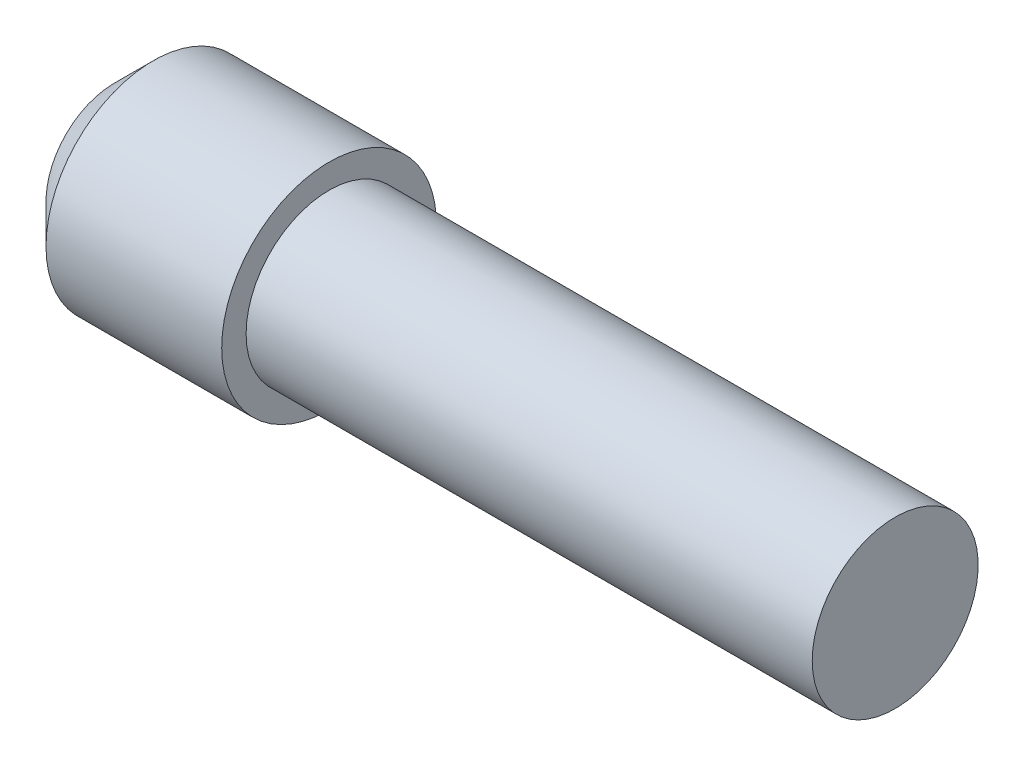
ISO-10303-21;
HEADER;
FILE_DESCRIPTION(('STEP AP214'),'2;1');
FILE_NAME('part.step','',(''),(''),'','','');
FILE_SCHEMA(('AUTOMOTIVE_DESIGN { 1 0 10303 214 1 1 1 1 }'));
ENDSEC;
DATA;
#1=APPLICATION_CONTEXT('core data for automotive mechanical design processes');
#2=APPLICATION_PROTOCOL_DEFINITION('international standard','automotive_design',2000,#1);
#3=PRODUCT_CONTEXT('',#1,'mechanical');
#4=PRODUCT('Part','Part','',(#3));
#5=PRODUCT_RELATED_PRODUCT_CATEGORY('part','',(#4));
#6=PRODUCT_DEFINITION_FORMATION('','',#4);
#7=PRODUCT_DEFINITION_CONTEXT('part definition',#1,'design');
#8=PRODUCT_DEFINITION('design','',#6,#7);
#9=PRODUCT_DEFINITION_SHAPE('','',#8);
#10=(LENGTH_UNIT() NAMED_UNIT(*) SI_UNIT(.MILLI.,.METRE.));
#11=(NAMED_UNIT(*) PLANE_ANGLE_UNIT() SI_UNIT($,.RADIAN.));
#12=(NAMED_UNIT(*) SI_UNIT($,.STERADIAN.) SOLID_ANGLE_UNIT());
#13=UNCERTAINTY_MEASURE_WITH_UNIT(LENGTH_MEASURE(1.E-05),#10,'distance_accuracy_value','');
#14=(GEOMETRIC_REPRESENTATION_CONTEXT(3) GLOBAL_UNCERTAINTY_ASSIGNED_CONTEXT((#13)) GLOBAL_UNIT_ASSIGNED_CONTEXT((#10,
#11,#12)) REPRESENTATION_CONTEXT('',''));
#15=CARTESIAN_POINT('',(0.,0.,0.));
#16=DIRECTION('',(0.,0.,1.));
#17=DIRECTION('',(1.,0.,0.));
#18=AXIS2_PLACEMENT_3D('',#15,#16,#17);
#19=CARTESIAN_POINT('',(0.,2.75,0.));
#20=DIRECTION('',(-1.,0.,0.));
#21=DIRECTION('',(0.,0.,1.));
#22=AXIS2_PLACEMENT_3D('',#19,#20,#21);
#23=PLANE('',#22);
#24=CARTESIAN_POINT('',(0.,0.,0.));
#25=DIRECTION('',(-1.,0.,0.));
#26=DIRECTION('',(0.,0.,1.));
#27=AXIS2_PLACEMENT_3D('',#24,#25,#26);
#28=CIRCLE('',#27,2.75);
#29=CARTESIAN_POINT('',(0.,0.,2.75));
#30=VERTEX_POINT('',#29);
#31=EDGE_CURVE('E50',#30,#30,#28,.T.);
#32=ORIENTED_EDGE('',*,*,#31,.F.);
#33=EDGE_LOOP('',(#32));
#34=FACE_BOUND('',#33,.T.);
#35=CARTESIAN_POINT('',(0.,0.,0.));
#36=DIRECTION('',(-1.,0.,0.));
#37=DIRECTION('',(0.,0.,1.));
#38=AXIS2_PLACEMENT_3D('',#35,#36,#37);
#39=CIRCLE('',#38,2.125);
#40=CARTESIAN_POINT('',(0.,0.,2.125));
#41=VERTEX_POINT('',#40);
#42=EDGE_CURVE('E59',#41,#41,#39,.T.);
#43=ORIENTED_EDGE('',*,*,#42,.T.);
#44=EDGE_LOOP('',(#43));
#45=FACE_BOUND('',#44,.T.);
#46=ADVANCED_FACE('F38',(#34,#45),#23,.F.);
#47=CARTESIAN_POINT('',(-9.45893719806763,0.,0.));
#48=DIRECTION('',(-1.,0.,0.));
#49=DIRECTION('',(0.,0.,1.));
#50=AXIS2_PLACEMENT_3D('',#47,#48,#49);
#51=CYLINDRICAL_SURFACE('',#50,2.75);
#52=CARTESIAN_POINT('',(-4.5,0.,0.));
#53=DIRECTION('',(1.,0.,0.));
#54=DIRECTION('',(0.,0.,-1.));
#55=AXIS2_PLACEMENT_3D('',#52,#53,#54);
#56=CIRCLE('',#55,2.75);
#57=CARTESIAN_POINT('',(-4.5,0.,-2.75));
#58=VERTEX_POINT('',#57);
#59=EDGE_CURVE('E10',#58,#58,#56,.T.);
#60=ORIENTED_EDGE('',*,*,#59,.T.);
#61=EDGE_LOOP('',(#60));
#62=FACE_BOUND('',#61,.T.);
#63=ORIENTED_EDGE('',*,*,#31,.T.);
#64=EDGE_LOOP('',(#63));
#65=FACE_BOUND('',#64,.T.);
#66=ADVANCED_FACE('F77',(#62,#65),#51,.T.);
#67=CARTESIAN_POINT('',(-5.5,2.75,0.));
#68=DIRECTION('',(1.,0.,0.));
#69=DIRECTION('',(0.,0.,-1.));
#70=AXIS2_PLACEMENT_3D('',#67,#68,#69);
#71=PLANE('',#70);
#72=CARTESIAN_POINT('',(-5.5,0.,0.));
#73=DIRECTION('',(1.,0.,0.));
#74=DIRECTION('',(0.,0.,-1.));
#75=AXIS2_PLACEMENT_3D('',#72,#73,#74);
#76=CIRCLE('',#75,1.75000000000001);
#77=CARTESIAN_POINT('',(-5.5,0.,-1.75000000000001));
#78=VERTEX_POINT('',#77);
#79=EDGE_CURVE('E46',#78,#78,#76,.F.);
#80=ORIENTED_EDGE('',*,*,#79,.T.);
#81=EDGE_LOOP('',(#80));
#82=FACE_BOUND('',#81,.T.);
#83=ADVANCED_FACE('F72',(#82),#71,.F.);
#84=CARTESIAN_POINT('',(14.5,2.125,0.));
#85=DIRECTION('',(-1.,0.,0.));
#86=DIRECTION('',(0.,0.,1.));
#87=AXIS2_PLACEMENT_3D('',#84,#85,#86);
#88=PLANE('',#87);
#89=CARTESIAN_POINT('',(14.5,0.,0.));
#90=DIRECTION('',(-1.,0.,0.));
#91=DIRECTION('',(0.,0.,1.));
#92=AXIS2_PLACEMENT_3D('',#89,#90,#91);
#93=CIRCLE('',#92,2.125);
#94=CARTESIAN_POINT('',(14.5,0.,2.125));
#95=VERTEX_POINT('',#94);
#96=EDGE_CURVE('E54',#95,#95,#93,.T.);
#97=ORIENTED_EDGE('',*,*,#96,.F.);
#98=EDGE_LOOP('',(#97));
#99=FACE_BOUND('',#98,.T.);
#100=ADVANCED_FACE('F67',(#99),#88,.F.);
#101=CARTESIAN_POINT('',(-9.45893719806763,0.,0.));
#102=DIRECTION('',(-1.,0.,0.));
#103=DIRECTION('',(0.,0.,1.));
#104=AXIS2_PLACEMENT_3D('',#101,#102,#103);
#105=CYLINDRICAL_SURFACE('',#104,2.125);
#106=ORIENTED_EDGE('',*,*,#42,.F.);
#107=EDGE_LOOP('',(#106));
#108=FACE_BOUND('',#107,.T.);
#109=ORIENTED_EDGE('',*,*,#96,.T.);
#110=EDGE_LOOP('',(#109));
#111=FACE_BOUND('',#110,.T.);
#112=ADVANCED_FACE('F64',(#108,#111),#105,.T.);
#113=CARTESIAN_POINT('',(-5.5,0.,0.));
#114=DIRECTION('',(1.,0.,0.));
#115=DIRECTION('',(0.,0.,-1.));
#116=AXIS2_PLACEMENT_3D('',#113,#114,#115);
#117=CONICAL_SURFACE('',#116,1.75000000000001,0.785398163397447);
#118=ORIENTED_EDGE('',*,*,#59,.F.);
#119=EDGE_LOOP('',(#118));
#120=FACE_BOUND('',#119,.T.);
#121=ORIENTED_EDGE('',*,*,#79,.F.);
#122=EDGE_LOOP('',(#121));
#123=FACE_BOUND('',#122,.T.);
#124=ADVANCED_FACE('F41',(#120,#123),#117,.T.);
#125=CLOSED_SHELL('',(#46,#66,#83,#100,#112,#124));
#126=MANIFOLD_SOLID_BREP('B2',#125);
#127=ADVANCED_BREP_SHAPE_REPRESENTATION('',(#18,#126),#14);
#128=SHAPE_DEFINITION_REPRESENTATION(#9,#127);
ENDSEC;
END-ISO-10303-21;
